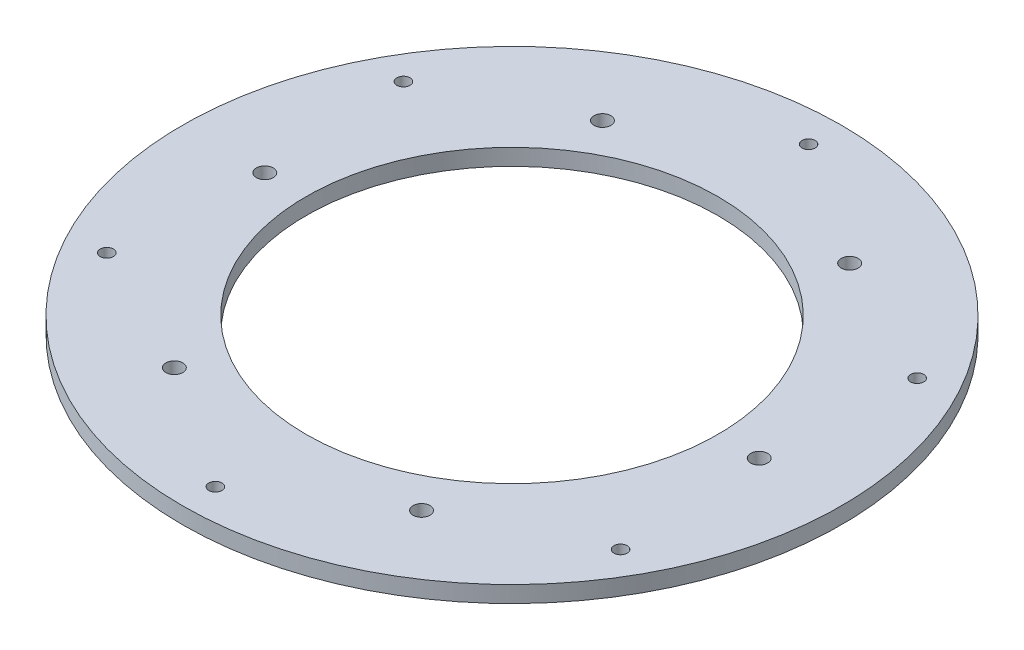
ISO-10303-21;
HEADER;
FILE_DESCRIPTION(('STEP AP214'),'2;1');
FILE_NAME('part.step','',(''),(''),'','','');
FILE_SCHEMA(('AUTOMOTIVE_DESIGN { 1 0 10303 214 1 1 1 1 }'));
ENDSEC;
DATA;
#1=APPLICATION_CONTEXT('core data for automotive mechanical design processes');
#2=APPLICATION_PROTOCOL_DEFINITION('international standard','automotive_design',2000,#1);
#3=PRODUCT_CONTEXT('',#1,'mechanical');
#4=PRODUCT('Part','Part','',(#3));
#5=PRODUCT_RELATED_PRODUCT_CATEGORY('part','',(#4));
#6=PRODUCT_DEFINITION_FORMATION('','',#4);
#7=PRODUCT_DEFINITION_CONTEXT('part definition',#1,'design');
#8=PRODUCT_DEFINITION('design','',#6,#7);
#9=PRODUCT_DEFINITION_SHAPE('','',#8);
#10=(LENGTH_UNIT() NAMED_UNIT(*) SI_UNIT(.MILLI.,.METRE.));
#11=(NAMED_UNIT(*) PLANE_ANGLE_UNIT() SI_UNIT($,.RADIAN.));
#12=(NAMED_UNIT(*) SI_UNIT($,.STERADIAN.) SOLID_ANGLE_UNIT());
#13=UNCERTAINTY_MEASURE_WITH_UNIT(LENGTH_MEASURE(1.E-05),#10,'distance_accuracy_value','');
#14=(GEOMETRIC_REPRESENTATION_CONTEXT(3) GLOBAL_UNCERTAINTY_ASSIGNED_CONTEXT((#13)) GLOBAL_UNIT_ASSIGNED_CONTEXT((#10,
#11,#12)) REPRESENTATION_CONTEXT('',''));
#15=CARTESIAN_POINT('',(0.,0.,0.));
#16=DIRECTION('',(0.,0.,1.));
#17=DIRECTION('',(1.,0.,0.));
#18=AXIS2_PLACEMENT_3D('',#15,#16,#17);
#19=CARTESIAN_POINT('',(0.,4.,0.));
#20=DIRECTION('',(0.,1.,0.));
#21=DIRECTION('',(0.,0.,1.));
#22=AXIS2_PLACEMENT_3D('',#19,#20,#21);
#23=PLANE('',#22);
#24=CARTESIAN_POINT('',(30.,4.,-51.9615242270663));
#25=DIRECTION('',(0.,1.,0.));
#26=DIRECTION('',(0.,0.,1.));
#27=AXIS2_PLACEMENT_3D('',#24,#25,#26);
#28=CIRCLE('',#27,2.04999999999999);
#29=CARTESIAN_POINT('',(30.,4.,-49.9115242270664));
#30=VERTEX_POINT('',#29);
#31=EDGE_CURVE('E87',#30,#30,#28,.T.);
#32=ORIENTED_EDGE('',*,*,#31,.F.);
#33=EDGE_LOOP('',(#32));
#34=FACE_BOUND('',#33,.T.);
#35=CARTESIAN_POINT('',(-60.,4.,0.));
#36=DIRECTION('',(0.,1.,0.));
#37=DIRECTION('',(0.,0.,1.));
#38=AXIS2_PLACEMENT_3D('',#35,#36,#37);
#39=CIRCLE('',#38,2.04999999999999);
#40=CARTESIAN_POINT('',(-60.,4.,2.05));
#41=VERTEX_POINT('',#40);
#42=EDGE_CURVE('E75',#41,#41,#39,.T.);
#43=ORIENTED_EDGE('',*,*,#42,.F.);
#44=EDGE_LOOP('',(#43));
#45=FACE_BOUND('',#44,.T.);
#46=CARTESIAN_POINT('',(30.,4.,51.9615242270663));
#47=DIRECTION('',(0.,1.,0.));
#48=DIRECTION('',(0.,0.,1.));
#49=AXIS2_PLACEMENT_3D('',#46,#47,#48);
#50=CIRCLE('',#49,2.05);
#51=CARTESIAN_POINT('',(30.,4.,54.0115242270663));
#52=VERTEX_POINT('',#51);
#53=EDGE_CURVE('E63',#52,#52,#50,.T.);
#54=ORIENTED_EDGE('',*,*,#53,.F.);
#55=EDGE_LOOP('',(#54));
#56=FACE_BOUND('',#55,.T.);
#57=CARTESIAN_POINT('',(60.,4.,0.));
#58=DIRECTION('',(0.,1.,0.));
#59=DIRECTION('',(0.,0.,1.));
#60=AXIS2_PLACEMENT_3D('',#57,#58,#59);
#61=CIRCLE('',#60,2.04999999999999);
#62=CARTESIAN_POINT('',(60.,4.,2.04999999999999));
#63=VERTEX_POINT('',#62);
#64=EDGE_CURVE('E57',#63,#63,#61,.T.);
#65=ORIENTED_EDGE('',*,*,#64,.F.);
#66=EDGE_LOOP('',(#65));
#67=FACE_BOUND('',#66,.T.);
#68=CARTESIAN_POINT('',(0.,4.,0.));
#69=DIRECTION('',(0.,1.,0.));
#70=DIRECTION('',(0.,0.,1.));
#71=AXIS2_PLACEMENT_3D('',#68,#69,#70);
#72=CIRCLE('',#71,80.);
#73=CARTESIAN_POINT('',(0.,4.,80.));
#74=VERTEX_POINT('',#73);
#75=EDGE_CURVE('E10',#74,#74,#72,.T.);
#76=ORIENTED_EDGE('',*,*,#75,.T.);
#77=EDGE_LOOP('',(#76));
#78=FACE_BOUND('',#77,.T.);
#79=CARTESIAN_POINT('',(0.,4.,0.));
#80=DIRECTION('',(0.,1.,0.));
#81=DIRECTION('',(0.,0.,1.));
#82=AXIS2_PLACEMENT_3D('',#79,#80,#81);
#83=CIRCLE('',#82,50.);
#84=CARTESIAN_POINT('',(0.,4.,50.));
#85=VERTEX_POINT('',#84);
#86=EDGE_CURVE('E52',#85,#85,#83,.T.);
#87=ORIENTED_EDGE('',*,*,#86,.F.);
#88=EDGE_LOOP('',(#87));
#89=FACE_BOUND('',#88,.T.);
#90=CARTESIAN_POINT('',(-30.,4.,51.9615242270663));
#91=DIRECTION('',(0.,1.,0.));
#92=DIRECTION('',(0.,0.,1.));
#93=AXIS2_PLACEMENT_3D('',#90,#91,#92);
#94=CIRCLE('',#93,2.05);
#95=CARTESIAN_POINT('',(-30.,4.,54.0115242270663));
#96=VERTEX_POINT('',#95);
#97=EDGE_CURVE('E69',#96,#96,#94,.T.);
#98=ORIENTED_EDGE('',*,*,#97,.F.);
#99=EDGE_LOOP('',(#98));
#100=FACE_BOUND('',#99,.T.);
#101=CARTESIAN_POINT('',(-30.,4.,-51.9615242270663));
#102=DIRECTION('',(0.,1.,0.));
#103=DIRECTION('',(0.,0.,1.));
#104=AXIS2_PLACEMENT_3D('',#101,#102,#103);
#105=CIRCLE('',#104,2.05);
#106=CARTESIAN_POINT('',(-30.,4.,-49.9115242270663));
#107=VERTEX_POINT('',#106);
#108=EDGE_CURVE('E81',#107,#107,#105,.T.);
#109=ORIENTED_EDGE('',*,*,#108,.F.);
#110=EDGE_LOOP('',(#109));
#111=FACE_BOUND('',#110,.T.);
#112=CARTESIAN_POINT('',(62.3538290724796,4.,-36.));
#113=DIRECTION('',(0.,1.,0.));
#114=DIRECTION('',(0.,0.,1.));
#115=AXIS2_PLACEMENT_3D('',#112,#113,#114);
#116=CIRCLE('',#115,1.60000000000001);
#117=CARTESIAN_POINT('',(62.3538290724796,4.,-34.4));
#118=VERTEX_POINT('',#117);
#119=EDGE_CURVE('E98',#118,#118,#116,.T.);
#120=ORIENTED_EDGE('',*,*,#119,.F.);
#121=EDGE_LOOP('',(#120));
#122=FACE_BOUND('',#121,.T.);
#123=CARTESIAN_POINT('',(62.3538290724796,4.,36.0000000000001));
#124=DIRECTION('',(0.,1.,0.));
#125=DIRECTION('',(0.,0.,1.));
#126=AXIS2_PLACEMENT_3D('',#123,#124,#125);
#127=CIRCLE('',#126,1.6);
#128=CARTESIAN_POINT('',(62.3538290724796,4.,37.6000000000001));
#129=VERTEX_POINT('',#128);
#130=EDGE_CURVE('E101',#129,#129,#127,.T.);
#131=ORIENTED_EDGE('',*,*,#130,.F.);
#132=EDGE_LOOP('',(#131));
#133=FACE_BOUND('',#132,.T.);
#134=CARTESIAN_POINT('',(0.,4.,72.));
#135=DIRECTION('',(0.,1.,0.));
#136=DIRECTION('',(0.,0.,1.));
#137=AXIS2_PLACEMENT_3D('',#134,#135,#136);
#138=CIRCLE('',#137,1.6);
#139=CARTESIAN_POINT('',(0.,4.,73.6));
#140=VERTEX_POINT('',#139);
#141=EDGE_CURVE('E107',#140,#140,#138,.T.);
#142=ORIENTED_EDGE('',*,*,#141,.F.);
#143=EDGE_LOOP('',(#142));
#144=FACE_BOUND('',#143,.T.);
#145=CARTESIAN_POINT('',(-62.3538290724796,4.,36.));
#146=DIRECTION('',(0.,1.,0.));
#147=DIRECTION('',(0.,0.,1.));
#148=AXIS2_PLACEMENT_3D('',#145,#146,#147);
#149=CIRCLE('',#148,1.6);
#150=CARTESIAN_POINT('',(-62.3538290724796,4.,37.6));
#151=VERTEX_POINT('',#150);
#152=EDGE_CURVE('E113',#151,#151,#149,.T.);
#153=ORIENTED_EDGE('',*,*,#152,.F.);
#154=EDGE_LOOP('',(#153));
#155=FACE_BOUND('',#154,.T.);
#156=CARTESIAN_POINT('',(-62.3538290724795,4.,-36.0000000000001));
#157=DIRECTION('',(0.,1.,0.));
#158=DIRECTION('',(0.,0.,1.));
#159=AXIS2_PLACEMENT_3D('',#156,#157,#158);
#160=CIRCLE('',#159,1.6);
#161=CARTESIAN_POINT('',(-62.3538290724795,4.,-34.4000000000001));
#162=VERTEX_POINT('',#161);
#163=EDGE_CURVE('E119',#162,#162,#160,.T.);
#164=ORIENTED_EDGE('',*,*,#163,.F.);
#165=EDGE_LOOP('',(#164));
#166=FACE_BOUND('',#165,.T.);
#167=CARTESIAN_POINT('',(0.,4.,-72.));
#168=DIRECTION('',(0.,1.,0.));
#169=DIRECTION('',(0.,0.,1.));
#170=AXIS2_PLACEMENT_3D('',#167,#168,#169);
#171=CIRCLE('',#170,1.6);
#172=CARTESIAN_POINT('',(0.,4.,-70.4));
#173=VERTEX_POINT('',#172);
#174=EDGE_CURVE('E125',#173,#173,#171,.T.);
#175=ORIENTED_EDGE('',*,*,#174,.F.);
#176=EDGE_LOOP('',(#175));
#177=FACE_BOUND('',#176,.T.);
#178=ADVANCED_FACE('F41',(#34,#45,#56,#67,#78,#89,#100,#111,#122,#133,#144,#155,#166,#177),#23,.T.);
#179=CARTESIAN_POINT('',(0.,0.,0.));
#180=DIRECTION('',(0.,1.,0.));
#181=DIRECTION('',(0.,0.,1.));
#182=AXIS2_PLACEMENT_3D('',#179,#180,#181);
#183=PLANE('',#182);
#184=CARTESIAN_POINT('',(0.,0.,0.));
#185=DIRECTION('',(0.,1.,0.));
#186=DIRECTION('',(0.,0.,1.));
#187=AXIS2_PLACEMENT_3D('',#184,#185,#186);
#188=CIRCLE('',#187,80.);
#189=CARTESIAN_POINT('',(0.,0.,80.));
#190=VERTEX_POINT('',#189);
#191=EDGE_CURVE('E45',#190,#190,#188,.T.);
#192=ORIENTED_EDGE('',*,*,#191,.F.);
#193=EDGE_LOOP('',(#192));
#194=FACE_BOUND('',#193,.T.);
#195=CARTESIAN_POINT('',(0.,0.,0.));
#196=DIRECTION('',(0.,1.,0.));
#197=DIRECTION('',(0.,0.,1.));
#198=AXIS2_PLACEMENT_3D('',#195,#196,#197);
#199=CIRCLE('',#198,50.);
#200=CARTESIAN_POINT('',(0.,0.,50.));
#201=VERTEX_POINT('',#200);
#202=EDGE_CURVE('E54',#201,#201,#199,.T.);
#203=ORIENTED_EDGE('',*,*,#202,.T.);
#204=EDGE_LOOP('',(#203));
#205=FACE_BOUND('',#204,.T.);
#206=CARTESIAN_POINT('',(60.,0.,0.));
#207=DIRECTION('',(0.,1.,0.));
#208=DIRECTION('',(0.,0.,1.));
#209=AXIS2_PLACEMENT_3D('',#206,#207,#208);
#210=CIRCLE('',#209,2.04999999999999);
#211=CARTESIAN_POINT('',(60.,0.,2.04999999999999));
#212=VERTEX_POINT('',#211);
#213=EDGE_CURVE('E60',#212,#212,#210,.T.);
#214=ORIENTED_EDGE('',*,*,#213,.T.);
#215=EDGE_LOOP('',(#214));
#216=FACE_BOUND('',#215,.T.);
#217=CARTESIAN_POINT('',(30.,0.,51.9615242270663));
#218=DIRECTION('',(0.,1.,0.));
#219=DIRECTION('',(0.,0.,1.));
#220=AXIS2_PLACEMENT_3D('',#217,#218,#219);
#221=CIRCLE('',#220,2.05);
#222=CARTESIAN_POINT('',(30.,0.,54.0115242270663));
#223=VERTEX_POINT('',#222);
#224=EDGE_CURVE('E66',#223,#223,#221,.T.);
#225=ORIENTED_EDGE('',*,*,#224,.T.);
#226=EDGE_LOOP('',(#225));
#227=FACE_BOUND('',#226,.T.);
#228=CARTESIAN_POINT('',(-30.,0.,51.9615242270663));
#229=DIRECTION('',(0.,1.,0.));
#230=DIRECTION('',(0.,0.,1.));
#231=AXIS2_PLACEMENT_3D('',#228,#229,#230);
#232=CIRCLE('',#231,2.05);
#233=CARTESIAN_POINT('',(-30.,0.,54.0115242270663));
#234=VERTEX_POINT('',#233);
#235=EDGE_CURVE('E72',#234,#234,#232,.T.);
#236=ORIENTED_EDGE('',*,*,#235,.T.);
#237=EDGE_LOOP('',(#236));
#238=FACE_BOUND('',#237,.T.);
#239=CARTESIAN_POINT('',(-60.,0.,0.));
#240=DIRECTION('',(0.,1.,0.));
#241=DIRECTION('',(0.,0.,1.));
#242=AXIS2_PLACEMENT_3D('',#239,#240,#241);
#243=CIRCLE('',#242,2.04999999999999);
#244=CARTESIAN_POINT('',(-60.,0.,2.05));
#245=VERTEX_POINT('',#244);
#246=EDGE_CURVE('E78',#245,#245,#243,.T.);
#247=ORIENTED_EDGE('',*,*,#246,.T.);
#248=EDGE_LOOP('',(#247));
#249=FACE_BOUND('',#248,.T.);
#250=CARTESIAN_POINT('',(-30.,0.,-51.9615242270663));
#251=DIRECTION('',(0.,1.,0.));
#252=DIRECTION('',(0.,0.,1.));
#253=AXIS2_PLACEMENT_3D('',#250,#251,#252);
#254=CIRCLE('',#253,2.05);
#255=CARTESIAN_POINT('',(-30.,0.,-49.9115242270663));
#256=VERTEX_POINT('',#255);
#257=EDGE_CURVE('E84',#256,#256,#254,.T.);
#258=ORIENTED_EDGE('',*,*,#257,.T.);
#259=EDGE_LOOP('',(#258));
#260=FACE_BOUND('',#259,.T.);
#261=CARTESIAN_POINT('',(30.,0.,-51.9615242270663));
#262=DIRECTION('',(0.,1.,0.));
#263=DIRECTION('',(0.,0.,1.));
#264=AXIS2_PLACEMENT_3D('',#261,#262,#263);
#265=CIRCLE('',#264,2.04999999999999);
#266=CARTESIAN_POINT('',(30.,0.,-49.9115242270664));
#267=VERTEX_POINT('',#266);
#268=EDGE_CURVE('E90',#267,#267,#265,.T.);
#269=ORIENTED_EDGE('',*,*,#268,.T.);
#270=EDGE_LOOP('',(#269));
#271=FACE_BOUND('',#270,.T.);
#272=CARTESIAN_POINT('',(62.3538290724796,0.,-36.));
#273=DIRECTION('',(0.,1.,0.));
#274=DIRECTION('',(0.,0.,1.));
#275=AXIS2_PLACEMENT_3D('',#272,#273,#274);
#276=CIRCLE('',#275,1.60000000000001);
#277=CARTESIAN_POINT('',(62.3538290724796,0.,-34.4));
#278=VERTEX_POINT('',#277);
#279=EDGE_CURVE('E93',#278,#278,#276,.F.);
#280=ORIENTED_EDGE('',*,*,#279,.F.);
#281=EDGE_LOOP('',(#280));
#282=FACE_BOUND('',#281,.T.);
#283=CARTESIAN_POINT('',(62.3538290724796,0.,36.0000000000001));
#284=DIRECTION('',(0.,1.,0.));
#285=DIRECTION('',(0.,0.,1.));
#286=AXIS2_PLACEMENT_3D('',#283,#284,#285);
#287=CIRCLE('',#286,1.6);
#288=CARTESIAN_POINT('',(62.3538290724796,0.,37.6000000000001));
#289=VERTEX_POINT('',#288);
#290=EDGE_CURVE('E104',#289,#289,#287,.F.);
#291=ORIENTED_EDGE('',*,*,#290,.F.);
#292=EDGE_LOOP('',(#291));
#293=FACE_BOUND('',#292,.T.);
#294=CARTESIAN_POINT('',(0.,0.,72.));
#295=DIRECTION('',(0.,1.,0.));
#296=DIRECTION('',(0.,0.,1.));
#297=AXIS2_PLACEMENT_3D('',#294,#295,#296);
#298=CIRCLE('',#297,1.6);
#299=CARTESIAN_POINT('',(0.,0.,73.6));
#300=VERTEX_POINT('',#299);
#301=EDGE_CURVE('E110',#300,#300,#298,.F.);
#302=ORIENTED_EDGE('',*,*,#301,.F.);
#303=EDGE_LOOP('',(#302));
#304=FACE_BOUND('',#303,.T.);
#305=CARTESIAN_POINT('',(-62.3538290724796,0.,36.));
#306=DIRECTION('',(0.,1.,0.));
#307=DIRECTION('',(0.,0.,1.));
#308=AXIS2_PLACEMENT_3D('',#305,#306,#307);
#309=CIRCLE('',#308,1.6);
#310=CARTESIAN_POINT('',(-62.3538290724796,0.,37.6));
#311=VERTEX_POINT('',#310);
#312=EDGE_CURVE('E116',#311,#311,#309,.F.);
#313=ORIENTED_EDGE('',*,*,#312,.F.);
#314=EDGE_LOOP('',(#313));
#315=FACE_BOUND('',#314,.T.);
#316=CARTESIAN_POINT('',(-62.3538290724795,0.,-36.0000000000001));
#317=DIRECTION('',(0.,1.,0.));
#318=DIRECTION('',(0.,0.,1.));
#319=AXIS2_PLACEMENT_3D('',#316,#317,#318);
#320=CIRCLE('',#319,1.6);
#321=CARTESIAN_POINT('',(-62.3538290724795,0.,-34.4000000000001));
#322=VERTEX_POINT('',#321);
#323=EDGE_CURVE('E122',#322,#322,#320,.F.);
#324=ORIENTED_EDGE('',*,*,#323,.F.);
#325=EDGE_LOOP('',(#324));
#326=FACE_BOUND('',#325,.T.);
#327=CARTESIAN_POINT('',(0.,0.,-72.));
#328=DIRECTION('',(0.,1.,0.));
#329=DIRECTION('',(0.,0.,1.));
#330=AXIS2_PLACEMENT_3D('',#327,#328,#329);
#331=CIRCLE('',#330,1.6);
#332=CARTESIAN_POINT('',(0.,0.,-70.4));
#333=VERTEX_POINT('',#332);
#334=EDGE_CURVE('E128',#333,#333,#331,.F.);
#335=ORIENTED_EDGE('',*,*,#334,.F.);
#336=EDGE_LOOP('',(#335));
#337=FACE_BOUND('',#336,.T.);
#338=ADVANCED_FACE('F135',(#194,#205,#216,#227,#238,#249,#260,#271,#282,#293,#304,#315,#326,
#337),#183,.F.);
#339=CARTESIAN_POINT('',(0.,4.,0.));
#340=DIRECTION('',(0.,-1.,0.));
#341=DIRECTION('',(0.,0.,-1.));
#342=AXIS2_PLACEMENT_3D('',#339,#340,#341);
#343=CYLINDRICAL_SURFACE('',#342,80.);
#344=ORIENTED_EDGE('',*,*,#75,.F.);
#345=EDGE_LOOP('',(#344));
#346=FACE_BOUND('',#345,.T.);
#347=ORIENTED_EDGE('',*,*,#191,.T.);
#348=EDGE_LOOP('',(#347));
#349=FACE_BOUND('',#348,.T.);
#350=ADVANCED_FACE('F43',(#346,#349),#343,.T.);
#351=CARTESIAN_POINT('',(0.,4.,0.));
#352=DIRECTION('',(0.,-1.,0.));
#353=DIRECTION('',(0.,0.,-1.));
#354=AXIS2_PLACEMENT_3D('',#351,#352,#353);
#355=CYLINDRICAL_SURFACE('',#354,50.);
#356=ORIENTED_EDGE('',*,*,#86,.T.);
#357=EDGE_LOOP('',(#356));
#358=FACE_BOUND('',#357,.T.);
#359=ORIENTED_EDGE('',*,*,#202,.F.);
#360=EDGE_LOOP('',(#359));
#361=FACE_BOUND('',#360,.T.);
#362=ADVANCED_FACE('F143',(#358,#361),#355,.F.);
#363=CARTESIAN_POINT('',(60.,4.,0.));
#364=DIRECTION('',(0.,-1.,0.));
#365=DIRECTION('',(0.,0.,-1.));
#366=AXIS2_PLACEMENT_3D('',#363,#364,#365);
#367=CYLINDRICAL_SURFACE('',#366,2.04999999999999);
#368=ORIENTED_EDGE('',*,*,#64,.T.);
#369=EDGE_LOOP('',(#368));
#370=FACE_BOUND('',#369,.T.);
#371=ORIENTED_EDGE('',*,*,#213,.F.);
#372=EDGE_LOOP('',(#371));
#373=FACE_BOUND('',#372,.T.);
#374=ADVANCED_FACE('F152',(#370,#373),#367,.F.);
#375=CARTESIAN_POINT('',(30.,4.,51.9615242270663));
#376=DIRECTION('',(0.,-1.,0.));
#377=DIRECTION('',(0.,0.,-1.));
#378=AXIS2_PLACEMENT_3D('',#375,#376,#377);
#379=CYLINDRICAL_SURFACE('',#378,2.05);
#380=ORIENTED_EDGE('',*,*,#53,.T.);
#381=EDGE_LOOP('',(#380));
#382=FACE_BOUND('',#381,.T.);
#383=ORIENTED_EDGE('',*,*,#224,.F.);
#384=EDGE_LOOP('',(#383));
#385=FACE_BOUND('',#384,.T.);
#386=ADVANCED_FACE('F156',(#382,#385),#379,.F.);
#387=CARTESIAN_POINT('',(-30.,4.,51.9615242270663));
#388=DIRECTION('',(0.,-1.,0.));
#389=DIRECTION('',(0.,0.,-1.));
#390=AXIS2_PLACEMENT_3D('',#387,#388,#389);
#391=CYLINDRICAL_SURFACE('',#390,2.05);
#392=ORIENTED_EDGE('',*,*,#97,.T.);
#393=EDGE_LOOP('',(#392));
#394=FACE_BOUND('',#393,.T.);
#395=ORIENTED_EDGE('',*,*,#235,.F.);
#396=EDGE_LOOP('',(#395));
#397=FACE_BOUND('',#396,.T.);
#398=ADVANCED_FACE('F160',(#394,#397),#391,.F.);
#399=CARTESIAN_POINT('',(-60.,4.,0.));
#400=DIRECTION('',(0.,-1.,0.));
#401=DIRECTION('',(0.,0.,-1.));
#402=AXIS2_PLACEMENT_3D('',#399,#400,#401);
#403=CYLINDRICAL_SURFACE('',#402,2.04999999999999);
#404=ORIENTED_EDGE('',*,*,#42,.T.);
#405=EDGE_LOOP('',(#404));
#406=FACE_BOUND('',#405,.T.);
#407=ORIENTED_EDGE('',*,*,#246,.F.);
#408=EDGE_LOOP('',(#407));
#409=FACE_BOUND('',#408,.T.);
#410=ADVANCED_FACE('F164',(#406,#409),#403,.F.);
#411=CARTESIAN_POINT('',(-30.,4.,-51.9615242270663));
#412=DIRECTION('',(0.,-1.,0.));
#413=DIRECTION('',(0.,0.,-1.));
#414=AXIS2_PLACEMENT_3D('',#411,#412,#413);
#415=CYLINDRICAL_SURFACE('',#414,2.05);
#416=ORIENTED_EDGE('',*,*,#108,.T.);
#417=EDGE_LOOP('',(#416));
#418=FACE_BOUND('',#417,.T.);
#419=ORIENTED_EDGE('',*,*,#257,.F.);
#420=EDGE_LOOP('',(#419));
#421=FACE_BOUND('',#420,.T.);
#422=ADVANCED_FACE('F168',(#418,#421),#415,.F.);
#423=CARTESIAN_POINT('',(30.,4.,-51.9615242270663));
#424=DIRECTION('',(0.,-1.,0.));
#425=DIRECTION('',(0.,0.,-1.));
#426=AXIS2_PLACEMENT_3D('',#423,#424,#425);
#427=CYLINDRICAL_SURFACE('',#426,2.04999999999999);
#428=ORIENTED_EDGE('',*,*,#31,.T.);
#429=EDGE_LOOP('',(#428));
#430=FACE_BOUND('',#429,.T.);
#431=ORIENTED_EDGE('',*,*,#268,.F.);
#432=EDGE_LOOP('',(#431));
#433=FACE_BOUND('',#432,.T.);
#434=ADVANCED_FACE('F172',(#430,#433),#427,.F.);
#435=CARTESIAN_POINT('',(62.3538290724796,-5.79827560572968,-36.));
#436=DIRECTION('',(0.,1.,0.));
#437=DIRECTION('',(0.,0.,1.));
#438=AXIS2_PLACEMENT_3D('',#435,#436,#437);
#439=CYLINDRICAL_SURFACE('',#438,1.60000000000001);
#440=ORIENTED_EDGE('',*,*,#279,.T.);
#441=EDGE_LOOP('',(#440));
#442=FACE_BOUND('',#441,.T.);
#443=ORIENTED_EDGE('',*,*,#119,.T.);
#444=EDGE_LOOP('',(#443));
#445=FACE_BOUND('',#444,.T.);
#446=ADVANCED_FACE('F176',(#442,#445),#439,.F.);
#447=CARTESIAN_POINT('',(62.3538290724796,-5.79827560572968,36.0000000000001));
#448=DIRECTION('',(0.,1.,0.));
#449=DIRECTION('',(0.,0.,1.));
#450=AXIS2_PLACEMENT_3D('',#447,#448,#449);
#451=CYLINDRICAL_SURFACE('',#450,1.6);
#452=ORIENTED_EDGE('',*,*,#290,.T.);
#453=EDGE_LOOP('',(#452));
#454=FACE_BOUND('',#453,.T.);
#455=ORIENTED_EDGE('',*,*,#130,.T.);
#456=EDGE_LOOP('',(#455));
#457=FACE_BOUND('',#456,.T.);
#458=ADVANCED_FACE('F179',(#454,#457),#451,.F.);
#459=CARTESIAN_POINT('',(0.,-5.79827560572968,72.));
#460=DIRECTION('',(0.,1.,0.));
#461=DIRECTION('',(0.,0.,1.));
#462=AXIS2_PLACEMENT_3D('',#459,#460,#461);
#463=CYLINDRICAL_SURFACE('',#462,1.6);
#464=ORIENTED_EDGE('',*,*,#301,.T.);
#465=EDGE_LOOP('',(#464));
#466=FACE_BOUND('',#465,.T.);
#467=ORIENTED_EDGE('',*,*,#141,.T.);
#468=EDGE_LOOP('',(#467));
#469=FACE_BOUND('',#468,.T.);
#470=ADVANCED_FACE('F183',(#466,#469),#463,.F.);
#471=CARTESIAN_POINT('',(-62.3538290724796,-5.79827560572968,36.));
#472=DIRECTION('',(0.,1.,0.));
#473=DIRECTION('',(0.,0.,1.));
#474=AXIS2_PLACEMENT_3D('',#471,#472,#473);
#475=CYLINDRICAL_SURFACE('',#474,1.6);
#476=ORIENTED_EDGE('',*,*,#312,.T.);
#477=EDGE_LOOP('',(#476));
#478=FACE_BOUND('',#477,.T.);
#479=ORIENTED_EDGE('',*,*,#152,.T.);
#480=EDGE_LOOP('',(#479));
#481=FACE_BOUND('',#480,.T.);
#482=ADVANCED_FACE('F187',(#478,#481),#475,.F.);
#483=CARTESIAN_POINT('',(-62.3538290724795,-5.79827560572968,-36.0000000000001));
#484=DIRECTION('',(0.,1.,0.));
#485=DIRECTION('',(0.,0.,1.));
#486=AXIS2_PLACEMENT_3D('',#483,#484,#485);
#487=CYLINDRICAL_SURFACE('',#486,1.6);
#488=ORIENTED_EDGE('',*,*,#323,.T.);
#489=EDGE_LOOP('',(#488));
#490=FACE_BOUND('',#489,.T.);
#491=ORIENTED_EDGE('',*,*,#163,.T.);
#492=EDGE_LOOP('',(#491));
#493=FACE_BOUND('',#492,.T.);
#494=ADVANCED_FACE('F191',(#490,#493),#487,.F.);
#495=CARTESIAN_POINT('',(0.,-5.79827560572968,-72.));
#496=DIRECTION('',(0.,1.,0.));
#497=DIRECTION('',(0.,0.,1.));
#498=AXIS2_PLACEMENT_3D('',#495,#496,#497);
#499=CYLINDRICAL_SURFACE('',#498,1.6);
#500=ORIENTED_EDGE('',*,*,#334,.T.);
#501=EDGE_LOOP('',(#500));
#502=FACE_BOUND('',#501,.T.);
#503=ORIENTED_EDGE('',*,*,#174,.T.);
#504=EDGE_LOOP('',(#503));
#505=FACE_BOUND('',#504,.T.);
#506=ADVANCED_FACE('F132',(#502,#505),#499,.F.);
#507=CLOSED_SHELL('',(#178,#338,#350,#362,#374,#386,#398,#410,#422,#434,#446,#458,#470,#482,
#494,#506));
#508=MANIFOLD_SOLID_BREP('B2',#507);
#509=ADVANCED_BREP_SHAPE_REPRESENTATION('',(#18,#508),#14);
#510=SHAPE_DEFINITION_REPRESENTATION(#9,#509);
ENDSEC;
END-ISO-10303-21;
